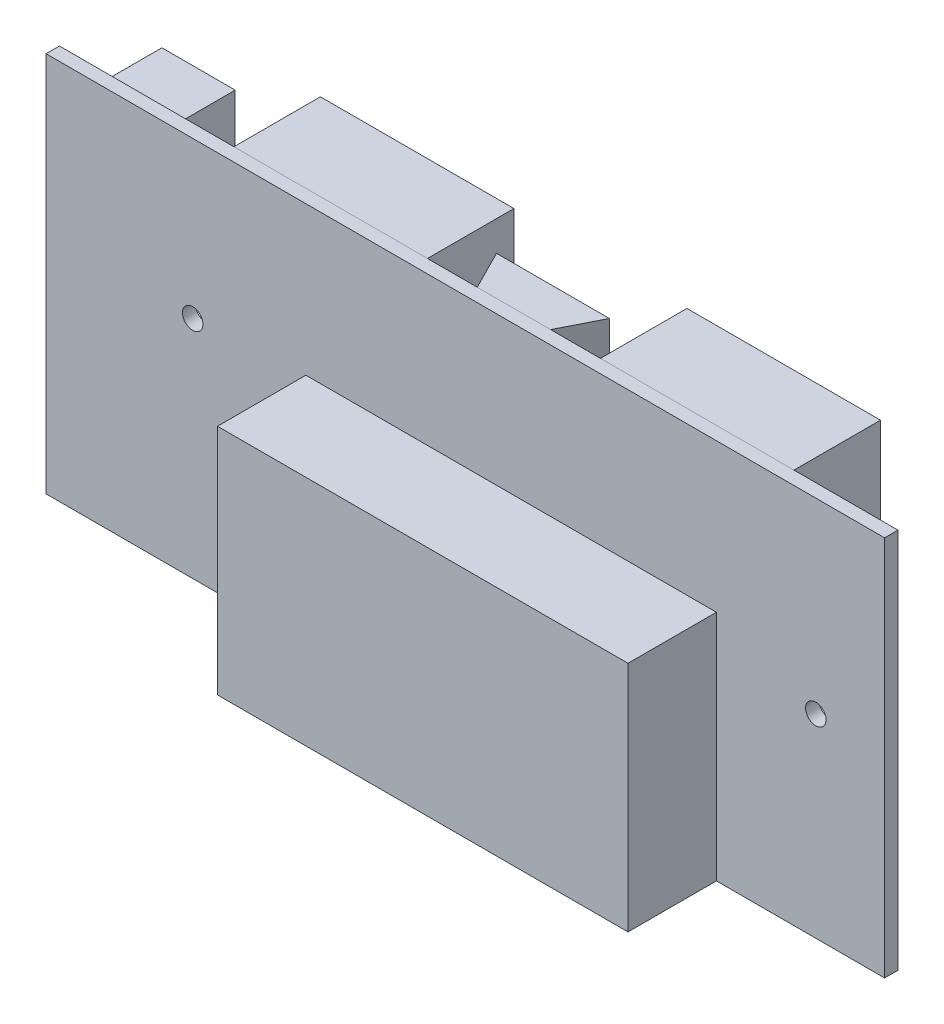
ISO-10303-21;
HEADER;
FILE_DESCRIPTION(('STEP AP214'),'2;1');
FILE_NAME('part.step','',(''),(''),'','','');
FILE_SCHEMA(('AUTOMOTIVE_DESIGN { 1 0 10303 214 1 1 1 1 }'));
ENDSEC;
DATA;
#1=APPLICATION_CONTEXT('core data for automotive mechanical design processes');
#2=APPLICATION_PROTOCOL_DEFINITION('international standard','automotive_design',2000,#1);
#3=PRODUCT_CONTEXT('',#1,'mechanical');
#4=PRODUCT('Part','Part','',(#3));
#5=PRODUCT_RELATED_PRODUCT_CATEGORY('part','',(#4));
#6=PRODUCT_DEFINITION_FORMATION('','',#4);
#7=PRODUCT_DEFINITION_CONTEXT('part definition',#1,'design');
#8=PRODUCT_DEFINITION('design','',#6,#7);
#9=PRODUCT_DEFINITION_SHAPE('','',#8);
#10=(LENGTH_UNIT() NAMED_UNIT(*) SI_UNIT(.MILLI.,.METRE.));
#11=(NAMED_UNIT(*) PLANE_ANGLE_UNIT() SI_UNIT($,.RADIAN.));
#12=(NAMED_UNIT(*) SI_UNIT($,.STERADIAN.) SOLID_ANGLE_UNIT());
#13=UNCERTAINTY_MEASURE_WITH_UNIT(LENGTH_MEASURE(1.E-05),#10,'distance_accuracy_value','');
#14=(GEOMETRIC_REPRESENTATION_CONTEXT(3) GLOBAL_UNCERTAINTY_ASSIGNED_CONTEXT((#13)) GLOBAL_UNIT_ASSIGNED_CONTEXT((#10,
#11,#12)) REPRESENTATION_CONTEXT('',''));
#15=CARTESIAN_POINT('',(0.,0.,0.));
#16=DIRECTION('',(0.,0.,1.));
#17=DIRECTION('',(1.,0.,0.));
#18=AXIS2_PLACEMENT_3D('',#15,#16,#17);
#19=CARTESIAN_POINT('',(5.,22.4,-0.909999999999994));
#20=DIRECTION('',(0.,0.,1.));
#21=DIRECTION('',(1.,0.,0.));
#22=AXIS2_PLACEMENT_3D('',#19,#20,#21);
#23=PLANE('',#22);
#24=DIRECTION('',(0.,1.,0.));
#25=VECTOR('',#24,1.);
#26=CARTESIAN_POINT('',(0.,22.4,-0.909999999999994));
#27=LINE('',#26,#25);
#28=CARTESIAN_POINT('',(0.,16.4,-0.909999999999994));
#29=VERTEX_POINT('',#28);
#30=CARTESIAN_POINT('',(0.,22.4,-0.909999999999994));
#31=VERTEX_POINT('',#30);
#32=EDGE_CURVE('E113',#29,#31,#27,.T.);
#33=ORIENTED_EDGE('',*,*,#32,.F.);
#34=DIRECTION('',(-1.,0.,0.));
#35=VECTOR('',#34,1.);
#36=CARTESIAN_POINT('',(5.,16.4,-0.909999999999994));
#37=LINE('',#36,#35);
#38=CARTESIAN_POINT('',(5.,16.4,-0.909999999999994));
#39=VERTEX_POINT('',#38);
#40=EDGE_CURVE('E56',#39,#29,#37,.T.);
#41=ORIENTED_EDGE('',*,*,#40,.F.);
#42=DIRECTION('',(0.,1.,0.));
#43=VECTOR('',#42,1.);
#44=CARTESIAN_POINT('',(5.,22.4,-0.909999999999994));
#45=LINE('',#44,#43);
#46=CARTESIAN_POINT('',(5.,22.4,-0.909999999999994));
#47=VERTEX_POINT('',#46);
#48=EDGE_CURVE('E107',#39,#47,#45,.T.);
#49=ORIENTED_EDGE('',*,*,#48,.T.);
#50=DIRECTION('',(-1.,0.,0.));
#51=VECTOR('',#50,1.);
#52=CARTESIAN_POINT('',(5.,22.4,-0.909999999999994));
#53=LINE('',#52,#51);
#54=EDGE_CURVE('E50',#47,#31,#53,.T.);
#55=ORIENTED_EDGE('',*,*,#54,.T.);
#56=EDGE_LOOP('',(#33,#41,#49,#55));
#57=FACE_BOUND('',#56,.T.);
#58=ADVANCED_FACE('F47',(#57),#23,.T.);
#59=CARTESIAN_POINT('',(5.,16.4,-0.909999999999994));
#60=DIRECTION('',(0.,-1.,0.));
#61=DIRECTION('',(0.,0.,-1.));
#62=AXIS2_PLACEMENT_3D('',#59,#60,#61);
#63=PLANE('',#62);
#64=DIRECTION('',(0.,0.,1.));
#65=VECTOR('',#64,1.);
#66=CARTESIAN_POINT('',(0.,16.4,-0.909999999999994));
#67=LINE('',#66,#65);
#68=CARTESIAN_POINT('',(0.,16.4,-7.89999999999999));
#69=VERTEX_POINT('',#68);
#70=EDGE_CURVE('E109',#69,#29,#67,.T.);
#71=ORIENTED_EDGE('',*,*,#70,.F.);
#72=DIRECTION('',(-1.,0.,0.));
#73=VECTOR('',#72,1.);
#74=CARTESIAN_POINT('',(5.,16.4,-7.89999999999999));
#75=LINE('',#74,#73);
#76=CARTESIAN_POINT('',(5.,16.4,-7.89999999999999));
#77=VERTEX_POINT('',#76);
#78=EDGE_CURVE('E81',#77,#69,#75,.T.);
#79=ORIENTED_EDGE('',*,*,#78,.F.);
#80=DIRECTION('',(0.,0.,1.));
#81=VECTOR('',#80,1.);
#82=CARTESIAN_POINT('',(5.,16.4,-0.909999999999994));
#83=LINE('',#82,#81);
#84=EDGE_CURVE('E104',#77,#39,#83,.T.);
#85=ORIENTED_EDGE('',*,*,#84,.T.);
#86=ORIENTED_EDGE('',*,*,#40,.T.);
#87=EDGE_LOOP('',(#71,#79,#85,#86));
#88=FACE_BOUND('',#87,.T.);
#89=ADVANCED_FACE('F125',(#88),#63,.T.);
#90=CARTESIAN_POINT('',(5.,22.4,-7.89999999999999));
#91=DIRECTION('',(0.,0.,-1.));
#92=DIRECTION('',(-1.,0.,0.));
#93=AXIS2_PLACEMENT_3D('',#90,#91,#92);
#94=PLANE('',#93);
#95=DIRECTION('',(0.,-1.,0.));
#96=VECTOR('',#95,1.);
#97=CARTESIAN_POINT('',(0.,22.4,-7.89999999999999));
#98=LINE('',#97,#96);
#99=CARTESIAN_POINT('',(0.,22.4,-7.89999999999999));
#100=VERTEX_POINT('',#99);
#101=EDGE_CURVE('E99',#100,#69,#98,.T.);
#102=ORIENTED_EDGE('',*,*,#101,.F.);
#103=DIRECTION('',(-1.,0.,0.));
#104=VECTOR('',#103,1.);
#105=CARTESIAN_POINT('',(5.,22.4,-7.89999999999999));
#106=LINE('',#105,#104);
#107=CARTESIAN_POINT('',(5.,22.4,-7.89999999999999));
#108=VERTEX_POINT('',#107);
#109=EDGE_CURVE('E94',#108,#100,#106,.T.);
#110=ORIENTED_EDGE('',*,*,#109,.F.);
#111=DIRECTION('',(0.,-1.,0.));
#112=VECTOR('',#111,1.);
#113=CARTESIAN_POINT('',(5.,22.4,-7.89999999999999));
#114=LINE('',#113,#112);
#115=EDGE_CURVE('E97',#108,#77,#114,.T.);
#116=ORIENTED_EDGE('',*,*,#115,.T.);
#117=ORIENTED_EDGE('',*,*,#78,.T.);
#118=EDGE_LOOP('',(#102,#110,#116,#117));
#119=FACE_BOUND('',#118,.T.);
#120=ADVANCED_FACE('F96',(#119),#94,.T.);
#121=CARTESIAN_POINT('',(5.,22.4,-0.909999999999994));
#122=DIRECTION('',(0.,1.,0.));
#123=DIRECTION('',(0.,0.,1.));
#124=AXIS2_PLACEMENT_3D('',#121,#122,#123);
#125=PLANE('',#124);
#126=DIRECTION('',(0.,0.,-1.));
#127=VECTOR('',#126,1.);
#128=CARTESIAN_POINT('',(0.,22.4,-0.909999999999994));
#129=LINE('',#128,#127);
#130=EDGE_CURVE('E116',#31,#100,#129,.T.);
#131=ORIENTED_EDGE('',*,*,#130,.F.);
#132=ORIENTED_EDGE('',*,*,#54,.F.);
#133=DIRECTION('',(0.,0.,-1.));
#134=VECTOR('',#133,1.);
#135=CARTESIAN_POINT('',(5.,22.4,-0.909999999999994));
#136=LINE('',#135,#134);
#137=EDGE_CURVE('E103',#47,#108,#136,.T.);
#138=ORIENTED_EDGE('',*,*,#137,.T.);
#139=ORIENTED_EDGE('',*,*,#109,.T.);
#140=EDGE_LOOP('',(#131,#132,#138,#139));
#141=FACE_BOUND('',#140,.T.);
#142=ADVANCED_FACE('F106',(#141),#125,.T.);
#143=CARTESIAN_POINT('',(5.,0.,0.));
#144=DIRECTION('',(1.,0.,0.));
#145=DIRECTION('',(0.,0.,-1.));
#146=AXIS2_PLACEMENT_3D('',#143,#144,#145);
#147=PLANE('',#146);
#148=ORIENTED_EDGE('',*,*,#48,.F.);
#149=ORIENTED_EDGE('',*,*,#84,.F.);
#150=ORIENTED_EDGE('',*,*,#115,.F.);
#151=ORIENTED_EDGE('',*,*,#137,.F.);
#152=EDGE_LOOP('',(#148,#149,#150,#151));
#153=FACE_BOUND('',#152,.T.);
#154=ADVANCED_FACE('F102',(#153),#147,.T.);
#155=CARTESIAN_POINT('',(0.,0.,0.));
#156=DIRECTION('',(1.,0.,0.));
#157=DIRECTION('',(0.,0.,-1.));
#158=AXIS2_PLACEMENT_3D('',#155,#156,#157);
#159=PLANE('',#158);
#160=CARTESIAN_POINT('',(0.,19.4,-4.40499999999999));
#161=DIRECTION('',(-1.,0.,0.));
#162=DIRECTION('',(0.,0.,1.));
#163=AXIS2_PLACEMENT_3D('',#160,#161,#162);
#164=CIRCLE('',#163,1.);
#165=CARTESIAN_POINT('',(0.,19.4,-3.40499999999999));
#166=VERTEX_POINT('',#165);
#167=EDGE_CURVE('E12',#166,#166,#164,.T.);
#168=ORIENTED_EDGE('',*,*,#167,.F.);
#169=EDGE_LOOP('',(#168));
#170=FACE_BOUND('',#169,.T.);
#171=ORIENTED_EDGE('',*,*,#32,.T.);
#172=ORIENTED_EDGE('',*,*,#130,.T.);
#173=ORIENTED_EDGE('',*,*,#101,.T.);
#174=ORIENTED_EDGE('',*,*,#70,.T.);
#175=EDGE_LOOP('',(#171,#172,#173,#174));
#176=FACE_BOUND('',#175,.T.);
#177=ADVANCED_FACE('F124',(#170,#176),#159,.F.);
#178=CARTESIAN_POINT('',(-1.,19.4,-4.40499999999999));
#179=DIRECTION('',(1.,0.,0.));
#180=DIRECTION('',(0.,0.,-1.));
#181=AXIS2_PLACEMENT_3D('',#178,#179,#180);
#182=CYLINDRICAL_SURFACE('',#181,1.);
#183=CARTESIAN_POINT('',(-1.,19.4,-4.40499999999999));
#184=DIRECTION('',(-1.,0.,0.));
#185=DIRECTION('',(0.,0.,1.));
#186=AXIS2_PLACEMENT_3D('',#183,#184,#185);
#187=CIRCLE('',#186,1.);
#188=CARTESIAN_POINT('',(-1.,19.4,-3.40499999999999));
#189=VERTEX_POINT('',#188);
#190=EDGE_CURVE('E117',#189,#189,#187,.T.);
#191=ORIENTED_EDGE('',*,*,#190,.F.);
#192=EDGE_LOOP('',(#191));
#193=FACE_BOUND('',#192,.T.);
#194=ORIENTED_EDGE('',*,*,#167,.T.);
#195=EDGE_LOOP('',(#194));
#196=FACE_BOUND('',#195,.T.);
#197=ADVANCED_FACE('F142',(#193,#196),#182,.T.);
#198=CARTESIAN_POINT('',(-1.,19.4,-4.40499999999999));
#199=DIRECTION('',(-1.,0.,0.));
#200=DIRECTION('',(0.,0.,1.));
#201=AXIS2_PLACEMENT_3D('',#198,#199,#200);
#202=PLANE('',#201);
#203=ORIENTED_EDGE('',*,*,#190,.T.);
#204=EDGE_LOOP('',(#203));
#205=FACE_BOUND('',#204,.T.);
#206=ADVANCED_FACE('F147',(#205),#202,.T.);
#207=CLOSED_SHELL('',(#58,#89,#120,#142,#154,#177,#197,#206));
#208=MANIFOLD_SOLID_BREP('B2',#207);
#209=CARTESIAN_POINT('',(33.5,16.,-0.909999999999994));
#210=DIRECTION('',(-0.891729215454604,0.,-0.452569338670569));
#211=DIRECTION('',(-0.452569338670569,0.,0.891729215454604));
#212=AXIS2_PLACEMENT_3D('',#209,#210,#211);
#213=PLANE('',#212);
#214=DIRECTION('',(-0.452569338670569,0.,0.891729215454604));
#215=VECTOR('',#214,1.);
#216=CARTESIAN_POINT('',(33.5,26.,-0.909999999999994));
#217=LINE('',#216,#215);
#218=CARTESIAN_POINT('',(34.85,26.,-3.56999999999999));
#219=VERTEX_POINT('',#218);
#220=CARTESIAN_POINT('',(33.5,26.,-0.909999999999994));
#221=VERTEX_POINT('',#220);
#222=EDGE_CURVE('E257',#219,#221,#217,.T.);
#223=ORIENTED_EDGE('',*,*,#222,.T.);
#224=DIRECTION('',(0.,1.,0.));
#225=VECTOR('',#224,1.);
#226=CARTESIAN_POINT('',(33.5,16.,-0.909999999999994));
#227=LINE('',#226,#225);
#228=CARTESIAN_POINT('',(33.5,16.,-0.909999999999994));
#229=VERTEX_POINT('',#228);
#230=EDGE_CURVE('E45',#229,#221,#227,.T.);
#231=ORIENTED_EDGE('',*,*,#230,.F.);
#232=DIRECTION('',(-0.452569338670569,0.,0.891729215454604));
#233=VECTOR('',#232,1.);
#234=CARTESIAN_POINT('',(33.5,16.,-0.909999999999994));
#235=LINE('',#234,#233);
#236=CARTESIAN_POINT('',(34.85,16.,-3.56999999999999));
#237=VERTEX_POINT('',#236);
#238=EDGE_CURVE('E245',#237,#229,#235,.T.);
#239=ORIENTED_EDGE('',*,*,#238,.F.);
#240=DIRECTION('',(0.,1.,0.));
#241=VECTOR('',#240,1.);
#242=CARTESIAN_POINT('',(34.85,16.,-3.56999999999999));
#243=LINE('',#242,#241);
#244=EDGE_CURVE('E253',#237,#219,#243,.T.);
#245=ORIENTED_EDGE('',*,*,#244,.T.);
#246=EDGE_LOOP('',(#223,#231,#239,#245));
#247=FACE_BOUND('',#246,.T.);
#248=ADVANCED_FACE('F194',(#247),#213,.F.);
#249=CARTESIAN_POINT('',(33.5,16.,-0.909999999999994));
#250=DIRECTION('',(0.,0.,-1.));
#251=DIRECTION('',(-1.,0.,0.));
#252=AXIS2_PLACEMENT_3D('',#249,#250,#251);
#253=PLANE('',#252);
#254=DIRECTION('',(-1.,0.,0.));
#255=VECTOR('',#254,1.);
#256=CARTESIAN_POINT('',(33.5,26.,-0.909999999999994));
#257=LINE('',#256,#255);
#258=CARTESIAN_POINT('',(28.5,26.,-0.909999999999994));
#259=VERTEX_POINT('',#258);
#260=EDGE_CURVE('E249',#221,#259,#257,.T.);
#261=ORIENTED_EDGE('',*,*,#260,.T.);
#262=DIRECTION('',(0.,1.,0.));
#263=VECTOR('',#262,1.);
#264=CARTESIAN_POINT('',(28.5,16.,-0.909999999999994));
#265=LINE('',#264,#263);
#266=CARTESIAN_POINT('',(28.5,16.,-0.909999999999994));
#267=VERTEX_POINT('',#266);
#268=EDGE_CURVE('E202',#267,#259,#265,.T.);
#269=ORIENTED_EDGE('',*,*,#268,.F.);
#270=DIRECTION('',(-1.,0.,0.));
#271=VECTOR('',#270,1.);
#272=CARTESIAN_POINT('',(33.5,16.,-0.909999999999994));
#273=LINE('',#272,#271);
#274=EDGE_CURVE('E240',#229,#267,#273,.T.);
#275=ORIENTED_EDGE('',*,*,#274,.F.);
#276=ORIENTED_EDGE('',*,*,#230,.T.);
#277=EDGE_LOOP('',(#261,#269,#275,#276));
#278=FACE_BOUND('',#277,.T.);
#279=ADVANCED_FACE('F248',(#278),#253,.F.);
#280=CARTESIAN_POINT('',(28.5,16.,-0.909999999999994));
#281=DIRECTION('',(0.891729215454604,0.,-0.452569338670569));
#282=DIRECTION('',(-0.452569338670569,0.,-0.891729215454604));
#283=AXIS2_PLACEMENT_3D('',#280,#281,#282);
#284=PLANE('',#283);
#285=DIRECTION('',(-0.452569338670569,0.,-0.891729215454604));
#286=VECTOR('',#285,1.);
#287=CARTESIAN_POINT('',(28.5,26.,-0.909999999999994));
#288=LINE('',#287,#286);
#289=CARTESIAN_POINT('',(27.15,26.,-3.56999999999999));
#290=VERTEX_POINT('',#289);
#291=EDGE_CURVE('E227',#259,#290,#288,.T.);
#292=ORIENTED_EDGE('',*,*,#291,.T.);
#293=DIRECTION('',(0.,1.,0.));
#294=VECTOR('',#293,1.);
#295=CARTESIAN_POINT('',(27.15,16.,-3.56999999999999));
#296=LINE('',#295,#294);
#297=CARTESIAN_POINT('',(27.15,16.,-3.56999999999999));
#298=VERTEX_POINT('',#297);
#299=EDGE_CURVE('E250',#298,#290,#296,.T.);
#300=ORIENTED_EDGE('',*,*,#299,.F.);
#301=DIRECTION('',(-0.452569338670569,0.,-0.891729215454604));
#302=VECTOR('',#301,1.);
#303=CARTESIAN_POINT('',(28.5,16.,-0.909999999999994));
#304=LINE('',#303,#302);
#305=EDGE_CURVE('E243',#267,#298,#304,.T.);
#306=ORIENTED_EDGE('',*,*,#305,.F.);
#307=ORIENTED_EDGE('',*,*,#268,.T.);
#308=EDGE_LOOP('',(#292,#300,#306,#307));
#309=FACE_BOUND('',#308,.T.);
#310=ADVANCED_FACE('F251',(#309),#284,.F.);
#311=CARTESIAN_POINT('',(27.15,16.,-3.56999999999999));
#312=DIRECTION('',(0.,0.,1.));
#313=DIRECTION('',(1.,0.,0.));
#314=AXIS2_PLACEMENT_3D('',#311,#312,#313);
#315=PLANE('',#314);
#316=DIRECTION('',(1.,0.,0.));
#317=VECTOR('',#316,1.);
#318=CARTESIAN_POINT('',(27.15,26.,-3.56999999999999));
#319=LINE('',#318,#317);
#320=EDGE_CURVE('E233',#290,#219,#319,.T.);
#321=ORIENTED_EDGE('',*,*,#320,.T.);
#322=ORIENTED_EDGE('',*,*,#244,.F.);
#323=DIRECTION('',(1.,0.,0.));
#324=VECTOR('',#323,1.);
#325=CARTESIAN_POINT('',(27.15,16.,-3.56999999999999));
#326=LINE('',#325,#324);
#327=EDGE_CURVE('E210',#298,#237,#326,.T.);
#328=ORIENTED_EDGE('',*,*,#327,.F.);
#329=ORIENTED_EDGE('',*,*,#299,.T.);
#330=EDGE_LOOP('',(#321,#322,#328,#329));
#331=FACE_BOUND('',#330,.T.);
#332=ADVANCED_FACE('F264',(#331),#315,.F.);
#333=CARTESIAN_POINT('',(0.,16.,0.));
#334=DIRECTION('',(0.,-1.,0.));
#335=DIRECTION('',(0.,0.,-1.));
#336=AXIS2_PLACEMENT_3D('',#333,#334,#335);
#337=PLANE('',#336);
#338=ORIENTED_EDGE('',*,*,#238,.T.);
#339=ORIENTED_EDGE('',*,*,#274,.T.);
#340=ORIENTED_EDGE('',*,*,#305,.T.);
#341=ORIENTED_EDGE('',*,*,#327,.T.);
#342=EDGE_LOOP('',(#338,#339,#340,#341));
#343=FACE_BOUND('',#342,.T.);
#344=ADVANCED_FACE('F241',(#343),#337,.T.);
#345=CARTESIAN_POINT('',(0.,26.,0.));
#346=DIRECTION('',(0.,-1.,0.));
#347=DIRECTION('',(0.,0.,-1.));
#348=AXIS2_PLACEMENT_3D('',#345,#346,#347);
#349=PLANE('',#348);
#350=ORIENTED_EDGE('',*,*,#222,.F.);
#351=ORIENTED_EDGE('',*,*,#320,.F.);
#352=ORIENTED_EDGE('',*,*,#291,.F.);
#353=ORIENTED_EDGE('',*,*,#260,.F.);
#354=EDGE_LOOP('',(#350,#351,#352,#353));
#355=FACE_BOUND('',#354,.T.);
#356=ADVANCED_FACE('F267',(#355),#349,.F.);
#357=CLOSED_SHELL('',(#248,#279,#310,#332,#344,#356));
#358=MANIFOLD_SOLID_BREP('B6',#357);
#359=CARTESIAN_POINT('',(50.1,16.,-0.909999999999994));
#360=DIRECTION('',(-1.,0.,0.));
#361=DIRECTION('',(0.,0.,1.));
#362=AXIS2_PLACEMENT_3D('',#359,#360,#361);
#363=PLANE('',#362);
#364=DIRECTION('',(0.,0.,1.));
#365=VECTOR('',#364,1.);
#366=CARTESIAN_POINT('',(50.1,26.,-0.909999999999994));
#367=LINE('',#366,#365);
#368=CARTESIAN_POINT('',(50.1,26.,-6.81000000000001));
#369=VERTEX_POINT('',#368);
#370=CARTESIAN_POINT('',(50.1,26.,-0.909999999999994));
#371=VERTEX_POINT('',#370);
#372=EDGE_CURVE('E378',#369,#371,#367,.T.);
#373=ORIENTED_EDGE('',*,*,#372,.T.);
#374=DIRECTION('',(0.,1.,0.));
#375=VECTOR('',#374,1.);
#376=CARTESIAN_POINT('',(50.1,16.,-0.909999999999994));
#377=LINE('',#376,#375);
#378=CARTESIAN_POINT('',(50.1,16.,-0.909999999999994));
#379=VERTEX_POINT('',#378);
#380=EDGE_CURVE('E192',#379,#371,#377,.T.);
#381=ORIENTED_EDGE('',*,*,#380,.F.);
#382=DIRECTION('',(0.,0.,1.));
#383=VECTOR('',#382,1.);
#384=CARTESIAN_POINT('',(50.1,16.,-0.909999999999994));
#385=LINE('',#384,#383);
#386=CARTESIAN_POINT('',(50.1,16.,-6.81000000000001));
#387=VERTEX_POINT('',#386);
#388=EDGE_CURVE('E366',#387,#379,#385,.T.);
#389=ORIENTED_EDGE('',*,*,#388,.F.);
#390=DIRECTION('',(0.,1.,0.));
#391=VECTOR('',#390,1.);
#392=CARTESIAN_POINT('',(50.1,16.,-6.81000000000001));
#393=LINE('',#392,#391);
#394=EDGE_CURVE('E374',#387,#369,#393,.T.);
#395=ORIENTED_EDGE('',*,*,#394,.T.);
#396=EDGE_LOOP('',(#373,#381,#389,#395));
#397=FACE_BOUND('',#396,.T.);
#398=ADVANCED_FACE('F315',(#397),#363,.F.);
#399=CARTESIAN_POINT('',(36.9,16.,-0.909999999999994));
#400=DIRECTION('',(0.,0.,-1.));
#401=DIRECTION('',(-1.,0.,0.));
#402=AXIS2_PLACEMENT_3D('',#399,#400,#401);
#403=PLANE('',#402);
#404=DIRECTION('',(-1.,0.,0.));
#405=VECTOR('',#404,1.);
#406=CARTESIAN_POINT('',(36.9,26.,-0.909999999999994));
#407=LINE('',#406,#405);
#408=CARTESIAN_POINT('',(36.9,26.,-0.909999999999994));
#409=VERTEX_POINT('',#408);
#410=EDGE_CURVE('E370',#371,#409,#407,.T.);
#411=ORIENTED_EDGE('',*,*,#410,.T.);
#412=DIRECTION('',(0.,1.,0.));
#413=VECTOR('',#412,1.);
#414=CARTESIAN_POINT('',(36.9,16.,-0.909999999999994));
#415=LINE('',#414,#413);
#416=CARTESIAN_POINT('',(36.9,16.,-0.909999999999994));
#417=VERTEX_POINT('',#416);
#418=EDGE_CURVE('E323',#417,#409,#415,.T.);
#419=ORIENTED_EDGE('',*,*,#418,.F.);
#420=DIRECTION('',(-1.,0.,0.));
#421=VECTOR('',#420,1.);
#422=CARTESIAN_POINT('',(36.9,16.,-0.909999999999994));
#423=LINE('',#422,#421);
#424=EDGE_CURVE('E361',#379,#417,#423,.T.);
#425=ORIENTED_EDGE('',*,*,#424,.F.);
#426=ORIENTED_EDGE('',*,*,#380,.T.);
#427=EDGE_LOOP('',(#411,#419,#425,#426));
#428=FACE_BOUND('',#427,.T.);
#429=ADVANCED_FACE('F369',(#428),#403,.F.);
#430=CARTESIAN_POINT('',(36.9,16.,-0.909999999999994));
#431=DIRECTION('',(1.,0.,0.));
#432=DIRECTION('',(0.,0.,-1.));
#433=AXIS2_PLACEMENT_3D('',#430,#431,#432);
#434=PLANE('',#433);
#435=DIRECTION('',(0.,0.,-1.));
#436=VECTOR('',#435,1.);
#437=CARTESIAN_POINT('',(36.9,26.,-0.909999999999994));
#438=LINE('',#437,#436);
#439=CARTESIAN_POINT('',(36.9,26.,-6.81000000000001));
#440=VERTEX_POINT('',#439);
#441=EDGE_CURVE('E348',#409,#440,#438,.T.);
#442=ORIENTED_EDGE('',*,*,#441,.T.);
#443=DIRECTION('',(0.,1.,0.));
#444=VECTOR('',#443,1.);
#445=CARTESIAN_POINT('',(36.9,16.,-6.81000000000001));
#446=LINE('',#445,#444);
#447=CARTESIAN_POINT('',(36.9,16.,-6.81000000000001));
#448=VERTEX_POINT('',#447);
#449=EDGE_CURVE('E371',#448,#440,#446,.T.);
#450=ORIENTED_EDGE('',*,*,#449,.F.);
#451=DIRECTION('',(0.,0.,-1.));
#452=VECTOR('',#451,1.);
#453=CARTESIAN_POINT('',(36.9,16.,-0.909999999999994));
#454=LINE('',#453,#452);
#455=EDGE_CURVE('E364',#417,#448,#454,.T.);
#456=ORIENTED_EDGE('',*,*,#455,.F.);
#457=ORIENTED_EDGE('',*,*,#418,.T.);
#458=EDGE_LOOP('',(#442,#450,#456,#457));
#459=FACE_BOUND('',#458,.T.);
#460=ADVANCED_FACE('F372',(#459),#434,.F.);
#461=CARTESIAN_POINT('',(36.9,16.,-6.81000000000001));
#462=DIRECTION('',(0.,0.,1.));
#463=DIRECTION('',(1.,0.,0.));
#464=AXIS2_PLACEMENT_3D('',#461,#462,#463);
#465=PLANE('',#464);
#466=DIRECTION('',(1.,0.,0.));
#467=VECTOR('',#466,1.);
#468=CARTESIAN_POINT('',(36.9,26.,-6.81000000000001));
#469=LINE('',#468,#467);
#470=EDGE_CURVE('E354',#440,#369,#469,.T.);
#471=ORIENTED_EDGE('',*,*,#470,.T.);
#472=ORIENTED_EDGE('',*,*,#394,.F.);
#473=DIRECTION('',(1.,0.,0.));
#474=VECTOR('',#473,1.);
#475=CARTESIAN_POINT('',(36.9,16.,-6.81000000000001));
#476=LINE('',#475,#474);
#477=EDGE_CURVE('E331',#448,#387,#476,.T.);
#478=ORIENTED_EDGE('',*,*,#477,.F.);
#479=ORIENTED_EDGE('',*,*,#449,.T.);
#480=EDGE_LOOP('',(#471,#472,#478,#479));
#481=FACE_BOUND('',#480,.T.);
#482=ADVANCED_FACE('F385',(#481),#465,.F.);
#483=CARTESIAN_POINT('',(0.,16.,0.));
#484=DIRECTION('',(0.,-1.,0.));
#485=DIRECTION('',(0.,0.,-1.));
#486=AXIS2_PLACEMENT_3D('',#483,#484,#485);
#487=PLANE('',#486);
#488=ORIENTED_EDGE('',*,*,#388,.T.);
#489=ORIENTED_EDGE('',*,*,#424,.T.);
#490=ORIENTED_EDGE('',*,*,#455,.T.);
#491=ORIENTED_EDGE('',*,*,#477,.T.);
#492=EDGE_LOOP('',(#488,#489,#490,#491));
#493=FACE_BOUND('',#492,.T.);
#494=ADVANCED_FACE('F362',(#493),#487,.T.);
#495=CARTESIAN_POINT('',(0.,26.,0.));
#496=DIRECTION('',(0.,-1.,0.));
#497=DIRECTION('',(0.,0.,-1.));
#498=AXIS2_PLACEMENT_3D('',#495,#496,#497);
#499=PLANE('',#498);
#500=ORIENTED_EDGE('',*,*,#372,.F.);
#501=ORIENTED_EDGE('',*,*,#470,.F.);
#502=ORIENTED_EDGE('',*,*,#441,.F.);
#503=ORIENTED_EDGE('',*,*,#410,.F.);
#504=EDGE_LOOP('',(#500,#501,#502,#503));
#505=FACE_BOUND('',#504,.T.);
#506=ADVANCED_FACE('F388',(#505),#499,.F.);
#507=CLOSED_SHELL('',(#398,#429,#460,#482,#494,#506));
#508=MANIFOLD_SOLID_BREP('B39',#507);
#509=CARTESIAN_POINT('',(11.9,16.,-0.909999999999994));
#510=DIRECTION('',(1.,0.,0.));
#511=DIRECTION('',(0.,0.,-1.));
#512=AXIS2_PLACEMENT_3D('',#509,#510,#511);
#513=PLANE('',#512);
#514=DIRECTION('',(0.,0.,-1.));
#515=VECTOR('',#514,1.);
#516=CARTESIAN_POINT('',(11.9,26.,-0.909999999999994));
#517=LINE('',#516,#515);
#518=CARTESIAN_POINT('',(11.9,26.,-0.909999999999994));
#519=VERTEX_POINT('',#518);
#520=CARTESIAN_POINT('',(11.9,26.,-6.81000000000001));
#521=VERTEX_POINT('',#520);
#522=EDGE_CURVE('E498',#519,#521,#517,.T.);
#523=ORIENTED_EDGE('',*,*,#522,.T.);
#524=DIRECTION('',(0.,1.,0.));
#525=VECTOR('',#524,1.);
#526=CARTESIAN_POINT('',(11.9,16.,-6.81000000000001));
#527=LINE('',#526,#525);
#528=CARTESIAN_POINT('',(11.9,16.,-6.81000000000001));
#529=VERTEX_POINT('',#528);
#530=EDGE_CURVE('E313',#529,#521,#527,.T.);
#531=ORIENTED_EDGE('',*,*,#530,.F.);
#532=DIRECTION('',(0.,0.,-1.));
#533=VECTOR('',#532,1.);
#534=CARTESIAN_POINT('',(11.9,16.,-0.909999999999994));
#535=LINE('',#534,#533);
#536=CARTESIAN_POINT('',(11.9,16.,-0.909999999999994));
#537=VERTEX_POINT('',#536);
#538=EDGE_CURVE('E486',#537,#529,#535,.T.);
#539=ORIENTED_EDGE('',*,*,#538,.F.);
#540=DIRECTION('',(0.,1.,0.));
#541=VECTOR('',#540,1.);
#542=CARTESIAN_POINT('',(11.9,16.,-0.909999999999994));
#543=LINE('',#542,#541);
#544=EDGE_CURVE('E494',#537,#519,#543,.T.);
#545=ORIENTED_EDGE('',*,*,#544,.T.);
#546=EDGE_LOOP('',(#523,#531,#539,#545));
#547=FACE_BOUND('',#546,.T.);
#548=ADVANCED_FACE('F435',(#547),#513,.F.);
#549=CARTESIAN_POINT('',(25.1,16.,-6.81000000000001));
#550=DIRECTION('',(0.,0.,1.));
#551=DIRECTION('',(1.,0.,0.));
#552=AXIS2_PLACEMENT_3D('',#549,#550,#551);
#553=PLANE('',#552);
#554=DIRECTION('',(1.,0.,0.));
#555=VECTOR('',#554,1.);
#556=CARTESIAN_POINT('',(25.1,26.,-6.81000000000001));
#557=LINE('',#556,#555);
#558=CARTESIAN_POINT('',(25.1,26.,-6.81000000000001));
#559=VERTEX_POINT('',#558);
#560=EDGE_CURVE('E490',#521,#559,#557,.T.);
#561=ORIENTED_EDGE('',*,*,#560,.T.);
#562=DIRECTION('',(0.,1.,0.));
#563=VECTOR('',#562,1.);
#564=CARTESIAN_POINT('',(25.1,16.,-6.81000000000001));
#565=LINE('',#564,#563);
#566=CARTESIAN_POINT('',(25.1,16.,-6.81000000000001));
#567=VERTEX_POINT('',#566);
#568=EDGE_CURVE('E443',#567,#559,#565,.T.);
#569=ORIENTED_EDGE('',*,*,#568,.F.);
#570=DIRECTION('',(1.,0.,0.));
#571=VECTOR('',#570,1.);
#572=CARTESIAN_POINT('',(25.1,16.,-6.81000000000001));
#573=LINE('',#572,#571);
#574=EDGE_CURVE('E481',#529,#567,#573,.T.);
#575=ORIENTED_EDGE('',*,*,#574,.F.);
#576=ORIENTED_EDGE('',*,*,#530,.T.);
#577=EDGE_LOOP('',(#561,#569,#575,#576));
#578=FACE_BOUND('',#577,.T.);
#579=ADVANCED_FACE('F489',(#578),#553,.F.);
#580=CARTESIAN_POINT('',(25.1,16.,-0.909999999999994));
#581=DIRECTION('',(-1.,0.,0.));
#582=DIRECTION('',(0.,0.,1.));
#583=AXIS2_PLACEMENT_3D('',#580,#581,#582);
#584=PLANE('',#583);
#585=DIRECTION('',(0.,0.,1.));
#586=VECTOR('',#585,1.);
#587=CARTESIAN_POINT('',(25.1,26.,-0.909999999999994));
#588=LINE('',#587,#586);
#589=CARTESIAN_POINT('',(25.1,26.,-0.909999999999994));
#590=VERTEX_POINT('',#589);
#591=EDGE_CURVE('E468',#559,#590,#588,.T.);
#592=ORIENTED_EDGE('',*,*,#591,.T.);
#593=DIRECTION('',(0.,1.,0.));
#594=VECTOR('',#593,1.);
#595=CARTESIAN_POINT('',(25.1,16.,-0.909999999999994));
#596=LINE('',#595,#594);
#597=CARTESIAN_POINT('',(25.1,16.,-0.909999999999994));
#598=VERTEX_POINT('',#597);
#599=EDGE_CURVE('E491',#598,#590,#596,.T.);
#600=ORIENTED_EDGE('',*,*,#599,.F.);
#601=DIRECTION('',(0.,0.,1.));
#602=VECTOR('',#601,1.);
#603=CARTESIAN_POINT('',(25.1,16.,-0.909999999999994));
#604=LINE('',#603,#602);
#605=EDGE_CURVE('E484',#567,#598,#604,.T.);
#606=ORIENTED_EDGE('',*,*,#605,.F.);
#607=ORIENTED_EDGE('',*,*,#568,.T.);
#608=EDGE_LOOP('',(#592,#600,#606,#607));
#609=FACE_BOUND('',#608,.T.);
#610=ADVANCED_FACE('F492',(#609),#584,.F.);
#611=CARTESIAN_POINT('',(25.1,16.,-0.909999999999994));
#612=DIRECTION('',(0.,0.,-1.));
#613=DIRECTION('',(-1.,0.,0.));
#614=AXIS2_PLACEMENT_3D('',#611,#612,#613);
#615=PLANE('',#614);
#616=DIRECTION('',(-1.,0.,0.));
#617=VECTOR('',#616,1.);
#618=CARTESIAN_POINT('',(25.1,26.,-0.909999999999994));
#619=LINE('',#618,#617);
#620=EDGE_CURVE('E474',#590,#519,#619,.T.);
#621=ORIENTED_EDGE('',*,*,#620,.T.);
#622=ORIENTED_EDGE('',*,*,#544,.F.);
#623=DIRECTION('',(-1.,0.,0.));
#624=VECTOR('',#623,1.);
#625=CARTESIAN_POINT('',(25.1,16.,-0.909999999999994));
#626=LINE('',#625,#624);
#627=EDGE_CURVE('E451',#598,#537,#626,.T.);
#628=ORIENTED_EDGE('',*,*,#627,.F.);
#629=ORIENTED_EDGE('',*,*,#599,.T.);
#630=EDGE_LOOP('',(#621,#622,#628,#629));
#631=FACE_BOUND('',#630,.T.);
#632=ADVANCED_FACE('F505',(#631),#615,.F.);
#633=CARTESIAN_POINT('',(0.,16.,0.));
#634=DIRECTION('',(0.,1.,0.));
#635=DIRECTION('',(0.,0.,1.));
#636=AXIS2_PLACEMENT_3D('',#633,#634,#635);
#637=PLANE('',#636);
#638=ORIENTED_EDGE('',*,*,#538,.T.);
#639=ORIENTED_EDGE('',*,*,#574,.T.);
#640=ORIENTED_EDGE('',*,*,#605,.T.);
#641=ORIENTED_EDGE('',*,*,#627,.T.);
#642=EDGE_LOOP('',(#638,#639,#640,#641));
#643=FACE_BOUND('',#642,.T.);
#644=ADVANCED_FACE('F482',(#643),#637,.F.);
#645=CARTESIAN_POINT('',(0.,26.,0.));
#646=DIRECTION('',(0.,1.,0.));
#647=DIRECTION('',(0.,0.,1.));
#648=AXIS2_PLACEMENT_3D('',#645,#646,#647);
#649=PLANE('',#648);
#650=ORIENTED_EDGE('',*,*,#522,.F.);
#651=ORIENTED_EDGE('',*,*,#620,.F.);
#652=ORIENTED_EDGE('',*,*,#591,.F.);
#653=ORIENTED_EDGE('',*,*,#560,.F.);
#654=EDGE_LOOP('',(#650,#651,#652,#653));
#655=FACE_BOUND('',#654,.T.);
#656=ADVANCED_FACE('F508',(#655),#649,.T.);
#657=CLOSED_SHELL('',(#548,#579,#610,#632,#644,#656));
#658=MANIFOLD_SOLID_BREP('B186',#657);
#659=CARTESIAN_POINT('',(0.,0.,0.));
#660=DIRECTION('',(0.,0.,-1.));
#661=DIRECTION('',(-1.,0.,0.));
#662=AXIS2_PLACEMENT_3D('',#659,#660,#661);
#663=PLANE('',#662);
#664=CARTESIAN_POINT('',(10.,15.36,0.));
#665=DIRECTION('',(0.,0.,1.));
#666=DIRECTION('',(1.,0.,0.));
#667=AXIS2_PLACEMENT_3D('',#664,#665,#666);
#668=CIRCLE('',#667,0.699999999999999);
#669=CARTESIAN_POINT('',(10.7,15.36,0.));
#670=VERTEX_POINT('',#669);
#671=EDGE_CURVE('E670',#670,#670,#668,.T.);
#672=ORIENTED_EDGE('',*,*,#671,.F.);
#673=EDGE_LOOP('',(#672));
#674=FACE_BOUND('',#673,.T.);
#675=CARTESIAN_POINT('',(52.5,13.25,0.));
#676=DIRECTION('',(0.,0.,1.));
#677=DIRECTION('',(1.,0.,0.));
#678=AXIS2_PLACEMENT_3D('',#675,#676,#677);
#679=CIRCLE('',#678,0.700000000000001);
#680=CARTESIAN_POINT('',(53.2,13.25,0.));
#681=VERTEX_POINT('',#680);
#682=EDGE_CURVE('E675',#681,#681,#679,.T.);
#683=ORIENTED_EDGE('',*,*,#682,.F.);
#684=EDGE_LOOP('',(#683));
#685=FACE_BOUND('',#684,.T.);
#686=DIRECTION('',(0.,-1.,0.));
#687=VECTOR('',#686,1.);
#688=CARTESIAN_POINT('',(17.72,0.,0.));
#689=LINE('',#688,#687);
#690=CARTESIAN_POINT('',(17.72,15.87,0.));
#691=VERTEX_POINT('',#690);
#692=CARTESIAN_POINT('',(17.72,0.,0.));
#693=VERTEX_POINT('',#692);
#694=EDGE_CURVE('E563',#691,#693,#689,.T.);
#695=ORIENTED_EDGE('',*,*,#694,.F.);
#696=DIRECTION('',(-1.,0.,0.));
#697=VECTOR('',#696,1.);
#698=CARTESIAN_POINT('',(17.72,15.87,0.));
#699=LINE('',#698,#697);
#700=CARTESIAN_POINT('',(45.72,15.87,0.));
#701=VERTEX_POINT('',#700);
#702=EDGE_CURVE('E631',#701,#691,#699,.T.);
#703=ORIENTED_EDGE('',*,*,#702,.F.);
#704=DIRECTION('',(0.,1.,0.));
#705=VECTOR('',#704,1.);
#706=CARTESIAN_POINT('',(45.72,0.,0.));
#707=LINE('',#706,#705);
#708=CARTESIAN_POINT('',(45.72,0.,0.));
#709=VERTEX_POINT('',#708);
#710=EDGE_CURVE('E569',#709,#701,#707,.T.);
#711=ORIENTED_EDGE('',*,*,#710,.F.);
#712=DIRECTION('',(1.,0.,0.));
#713=VECTOR('',#712,1.);
#714=CARTESIAN_POINT('',(0.,0.,0.));
#715=LINE('',#714,#713);
#716=CARTESIAN_POINT('',(57.19,0.,0.));
#717=VERTEX_POINT('',#716);
#718=EDGE_CURVE('E637',#709,#717,#715,.T.);
#719=ORIENTED_EDGE('',*,*,#718,.T.);
#720=DIRECTION('',(0.,1.,0.));
#721=VECTOR('',#720,1.);
#722=CARTESIAN_POINT('',(57.19,0.,0.));
#723=LINE('',#722,#721);
#724=CARTESIAN_POINT('',(57.19,26.,0.));
#725=VERTEX_POINT('',#724);
#726=EDGE_CURVE('E659',#717,#725,#723,.T.);
#727=ORIENTED_EDGE('',*,*,#726,.T.);
#728=DIRECTION('',(-1.,0.,0.));
#729=VECTOR('',#728,1.);
#730=CARTESIAN_POINT('',(0.,26.,0.));
#731=LINE('',#730,#729);
#732=CARTESIAN_POINT('',(0.,26.,0.));
#733=VERTEX_POINT('',#732);
#734=EDGE_CURVE('E647',#725,#733,#731,.T.);
#735=ORIENTED_EDGE('',*,*,#734,.T.);
#736=DIRECTION('',(0.,-1.,0.));
#737=VECTOR('',#736,1.);
#738=CARTESIAN_POINT('',(0.,0.,0.));
#739=LINE('',#738,#737);
#740=CARTESIAN_POINT('',(0.,0.,0.));
#741=VERTEX_POINT('',#740);
#742=EDGE_CURVE('E634',#733,#741,#739,.T.);
#743=ORIENTED_EDGE('',*,*,#742,.T.);
#744=EDGE_CURVE('E657',#741,#693,#715,.T.);
#745=ORIENTED_EDGE('',*,*,#744,.T.);
#746=EDGE_LOOP('',(#695,#703,#711,#719,#727,#735,#743,#745));
#747=FACE_BOUND('',#746,.T.);
#748=ADVANCED_FACE('F546',(#674,#685,#747),#663,.F.);
#749=CARTESIAN_POINT('',(0.,0.,-0.909999999999994));
#750=DIRECTION('',(-1.,0.,0.));
#751=DIRECTION('',(0.,0.,1.));
#752=AXIS2_PLACEMENT_3D('',#749,#750,#751);
#753=PLANE('',#752);
#754=ORIENTED_EDGE('',*,*,#742,.F.);
#755=DIRECTION('',(0.,0.,1.));
#756=VECTOR('',#755,1.);
#757=CARTESIAN_POINT('',(0.,26.,-0.909999999999994));
#758=LINE('',#757,#756);
#759=CARTESIAN_POINT('',(0.,26.,-0.909999999999994));
#760=VERTEX_POINT('',#759);
#761=EDGE_CURVE('E433',#760,#733,#758,.T.);
#762=ORIENTED_EDGE('',*,*,#761,.F.);
#763=DIRECTION('',(0.,-1.,0.));
#764=VECTOR('',#763,1.);
#765=CARTESIAN_POINT('',(0.,0.,-0.909999999999994));
#766=LINE('',#765,#764);
#767=CARTESIAN_POINT('',(0.,0.,-0.909999999999994));
#768=VERTEX_POINT('',#767);
#769=EDGE_CURVE('E643',#760,#768,#766,.T.);
#770=ORIENTED_EDGE('',*,*,#769,.T.);
#771=DIRECTION('',(0.,0.,1.));
#772=VECTOR('',#771,1.);
#773=CARTESIAN_POINT('',(0.,0.,-0.909999999999994));
#774=LINE('',#773,#772);
#775=EDGE_CURVE('E655',#768,#741,#774,.T.);
#776=ORIENTED_EDGE('',*,*,#775,.T.);
#777=EDGE_LOOP('',(#754,#762,#770,#776));
#778=FACE_BOUND('',#777,.T.);
#779=ADVANCED_FACE('F548',(#778),#753,.T.);
#780=CARTESIAN_POINT('',(0.,26.,-0.909999999999994));
#781=DIRECTION('',(0.,1.,0.));
#782=DIRECTION('',(0.,0.,1.));
#783=AXIS2_PLACEMENT_3D('',#780,#781,#782);
#784=PLANE('',#783);
#785=ORIENTED_EDGE('',*,*,#734,.F.);
#786=DIRECTION('',(0.,0.,1.));
#787=VECTOR('',#786,1.);
#788=CARTESIAN_POINT('',(57.19,26.,-0.909999999999994));
#789=LINE('',#788,#787);
#790=CARTESIAN_POINT('',(57.19,26.,-0.909999999999994));
#791=VERTEX_POINT('',#790);
#792=EDGE_CURVE('E555',#791,#725,#789,.T.);
#793=ORIENTED_EDGE('',*,*,#792,.F.);
#794=DIRECTION('',(-1.,0.,0.));
#795=VECTOR('',#794,1.);
#796=CARTESIAN_POINT('',(0.,26.,-0.909999999999994));
#797=LINE('',#796,#795);
#798=EDGE_CURVE('E653',#791,#760,#797,.T.);
#799=ORIENTED_EDGE('',*,*,#798,.T.);
#800=ORIENTED_EDGE('',*,*,#761,.T.);
#801=EDGE_LOOP('',(#785,#793,#799,#800));
#802=FACE_BOUND('',#801,.T.);
#803=ADVANCED_FACE('F709',(#802),#784,.T.);
#804=CARTESIAN_POINT('',(57.19,0.,-0.909999999999994));
#805=DIRECTION('',(1.,0.,0.));
#806=DIRECTION('',(0.,0.,-1.));
#807=AXIS2_PLACEMENT_3D('',#804,#805,#806);
#808=PLANE('',#807);
#809=ORIENTED_EDGE('',*,*,#726,.F.);
#810=DIRECTION('',(0.,0.,1.));
#811=VECTOR('',#810,1.);
#812=CARTESIAN_POINT('',(57.19,0.,-0.909999999999994));
#813=LINE('',#812,#811);
#814=CARTESIAN_POINT('',(57.19,0.,-0.909999999999994));
#815=VERTEX_POINT('',#814);
#816=EDGE_CURVE('E665',#815,#717,#813,.T.);
#817=ORIENTED_EDGE('',*,*,#816,.F.);
#818=DIRECTION('',(0.,1.,0.));
#819=VECTOR('',#818,1.);
#820=CARTESIAN_POINT('',(57.19,0.,-0.909999999999994));
#821=LINE('',#820,#819);
#822=EDGE_CURVE('E650',#815,#791,#821,.T.);
#823=ORIENTED_EDGE('',*,*,#822,.T.);
#824=ORIENTED_EDGE('',*,*,#792,.T.);
#825=EDGE_LOOP('',(#809,#817,#823,#824));
#826=FACE_BOUND('',#825,.T.);
#827=ADVANCED_FACE('F716',(#826),#808,.T.);
#828=CARTESIAN_POINT('',(0.,0.,-0.909999999999994));
#829=DIRECTION('',(0.,-1.,0.));
#830=DIRECTION('',(0.,0.,-1.));
#831=AXIS2_PLACEMENT_3D('',#828,#829,#830);
#832=PLANE('',#831);
#833=ORIENTED_EDGE('',*,*,#744,.F.);
#834=ORIENTED_EDGE('',*,*,#775,.F.);
#835=DIRECTION('',(1.,0.,0.));
#836=VECTOR('',#835,1.);
#837=CARTESIAN_POINT('',(0.,0.,-0.909999999999994));
#838=LINE('',#837,#836);
#839=EDGE_CURVE('E646',#768,#815,#838,.T.);
#840=ORIENTED_EDGE('',*,*,#839,.T.);
#841=ORIENTED_EDGE('',*,*,#816,.T.);
#842=ORIENTED_EDGE('',*,*,#718,.F.);
#843=DIRECTION('',(0.,0.,-1.));
#844=VECTOR('',#843,1.);
#845=CARTESIAN_POINT('',(45.72,0.,6.03000000000001));
#846=LINE('',#845,#844);
#847=CARTESIAN_POINT('',(45.72,0.,6.03000000000001));
#848=VERTEX_POINT('',#847);
#849=EDGE_CURVE('E618',#848,#709,#846,.T.);
#850=ORIENTED_EDGE('',*,*,#849,.F.);
#851=DIRECTION('',(1.,0.,0.));
#852=VECTOR('',#851,1.);
#853=CARTESIAN_POINT('',(17.72,0.,6.03000000000001));
#854=LINE('',#853,#852);
#855=CARTESIAN_POINT('',(17.72,0.,6.03000000000001));
#856=VERTEX_POINT('',#855);
#857=EDGE_CURVE('E611',#856,#848,#854,.T.);
#858=ORIENTED_EDGE('',*,*,#857,.F.);
#859=DIRECTION('',(0.,0.,-1.));
#860=VECTOR('',#859,1.);
#861=CARTESIAN_POINT('',(17.72,0.,6.03000000000001));
#862=LINE('',#861,#860);
#863=EDGE_CURVE('E616',#856,#693,#862,.T.);
#864=ORIENTED_EDGE('',*,*,#863,.T.);
#865=EDGE_LOOP('',(#833,#834,#840,#841,#842,#850,#858,#864));
#866=FACE_BOUND('',#865,.T.);
#867=ADVANCED_FACE('F614',(#866),#832,.T.);
#868=CARTESIAN_POINT('',(0.,0.,-0.909999999999994));
#869=DIRECTION('',(0.,0.,-1.));
#870=DIRECTION('',(-1.,0.,0.));
#871=AXIS2_PLACEMENT_3D('',#868,#869,#870);
#872=PLANE('',#871);
#873=CARTESIAN_POINT('',(10.,15.36,-0.909999999999994));
#874=DIRECTION('',(0.,0.,-1.));
#875=DIRECTION('',(-1.,0.,0.));
#876=AXIS2_PLACEMENT_3D('',#873,#874,#875);
#877=CIRCLE('',#876,0.699999999999999);
#878=CARTESIAN_POINT('',(9.30000000000001,15.36,-0.909999999999994));
#879=VERTEX_POINT('',#878);
#880=EDGE_CURVE('E550',#879,#879,#877,.T.);
#881=ORIENTED_EDGE('',*,*,#880,.F.);
#882=EDGE_LOOP('',(#881));
#883=FACE_BOUND('',#882,.T.);
#884=CARTESIAN_POINT('',(52.5,13.25,-0.909999999999994));
#885=DIRECTION('',(0.,0.,-1.));
#886=DIRECTION('',(-1.,0.,0.));
#887=AXIS2_PLACEMENT_3D('',#884,#885,#886);
#888=CIRCLE('',#887,0.700000000000001);
#889=CARTESIAN_POINT('',(51.8,13.25,-0.909999999999994));
#890=VERTEX_POINT('',#889);
#891=EDGE_CURVE('E668',#890,#890,#888,.T.);
#892=ORIENTED_EDGE('',*,*,#891,.F.);
#893=EDGE_LOOP('',(#892));
#894=FACE_BOUND('',#893,.T.);
#895=ORIENTED_EDGE('',*,*,#769,.F.);
#896=ORIENTED_EDGE('',*,*,#798,.F.);
#897=ORIENTED_EDGE('',*,*,#822,.F.);
#898=ORIENTED_EDGE('',*,*,#839,.F.);
#899=EDGE_LOOP('',(#895,#896,#897,#898));
#900=FACE_BOUND('',#899,.T.);
#901=ADVANCED_FACE('F701',(#883,#894,#900),#872,.T.);
#902=CARTESIAN_POINT('',(17.72,0.,6.03000000000001));
#903=DIRECTION('',(1.,0.,0.));
#904=DIRECTION('',(0.,0.,-1.));
#905=AXIS2_PLACEMENT_3D('',#902,#903,#904);
#906=PLANE('',#905);
#907=ORIENTED_EDGE('',*,*,#694,.T.);
#908=ORIENTED_EDGE('',*,*,#863,.F.);
#909=DIRECTION('',(0.,-1.,0.));
#910=VECTOR('',#909,1.);
#911=CARTESIAN_POINT('',(17.72,0.,6.03000000000001));
#912=LINE('',#911,#910);
#913=CARTESIAN_POINT('',(17.72,15.87,6.03000000000001));
#914=VERTEX_POINT('',#913);
#915=EDGE_CURVE('E622',#914,#856,#912,.T.);
#916=ORIENTED_EDGE('',*,*,#915,.F.);
#917=DIRECTION('',(0.,0.,-1.));
#918=VECTOR('',#917,1.);
#919=CARTESIAN_POINT('',(17.72,15.87,6.03000000000001));
#920=LINE('',#919,#918);
#921=EDGE_CURVE('E684',#914,#691,#920,.T.);
#922=ORIENTED_EDGE('',*,*,#921,.T.);
#923=EDGE_LOOP('',(#907,#908,#916,#922));
#924=FACE_BOUND('',#923,.T.);
#925=ADVANCED_FACE('F633',(#924),#906,.F.);
#926=CARTESIAN_POINT('',(45.72,0.,6.03000000000001));
#927=DIRECTION('',(-1.,0.,0.));
#928=DIRECTION('',(0.,0.,1.));
#929=AXIS2_PLACEMENT_3D('',#926,#927,#928);
#930=PLANE('',#929);
#931=ORIENTED_EDGE('',*,*,#710,.T.);
#932=DIRECTION('',(0.,0.,-1.));
#933=VECTOR('',#932,1.);
#934=CARTESIAN_POINT('',(45.72,15.87,6.03000000000001));
#935=LINE('',#934,#933);
#936=CARTESIAN_POINT('',(45.72,15.87,6.03000000000001));
#937=VERTEX_POINT('',#936);
#938=EDGE_CURVE('E639',#937,#701,#935,.T.);
#939=ORIENTED_EDGE('',*,*,#938,.F.);
#940=DIRECTION('',(0.,1.,0.));
#941=VECTOR('',#940,1.);
#942=CARTESIAN_POINT('',(45.72,0.,6.03000000000001));
#943=LINE('',#942,#941);
#944=EDGE_CURVE('E621',#848,#937,#943,.T.);
#945=ORIENTED_EDGE('',*,*,#944,.F.);
#946=ORIENTED_EDGE('',*,*,#849,.T.);
#947=EDGE_LOOP('',(#931,#939,#945,#946));
#948=FACE_BOUND('',#947,.T.);
#949=ADVANCED_FACE('F693',(#948),#930,.F.);
#950=CARTESIAN_POINT('',(17.72,15.87,6.03000000000001));
#951=DIRECTION('',(0.,-1.,0.));
#952=DIRECTION('',(0.,0.,-1.));
#953=AXIS2_PLACEMENT_3D('',#950,#951,#952);
#954=PLANE('',#953);
#955=ORIENTED_EDGE('',*,*,#702,.T.);
#956=ORIENTED_EDGE('',*,*,#921,.F.);
#957=DIRECTION('',(-1.,0.,0.));
#958=VECTOR('',#957,1.);
#959=CARTESIAN_POINT('',(17.72,15.87,6.03000000000001));
#960=LINE('',#959,#958);
#961=EDGE_CURVE('E627',#937,#914,#960,.T.);
#962=ORIENTED_EDGE('',*,*,#961,.F.);
#963=ORIENTED_EDGE('',*,*,#938,.T.);
#964=EDGE_LOOP('',(#955,#956,#962,#963));
#965=FACE_BOUND('',#964,.T.);
#966=ADVANCED_FACE('F691',(#965),#954,.F.);
#967=CARTESIAN_POINT('',(0.,0.,6.03000000000001));
#968=DIRECTION('',(0.,0.,-1.));
#969=DIRECTION('',(-1.,0.,0.));
#970=AXIS2_PLACEMENT_3D('',#967,#968,#969);
#971=PLANE('',#970);
#972=ORIENTED_EDGE('',*,*,#915,.T.);
#973=ORIENTED_EDGE('',*,*,#857,.T.);
#974=ORIENTED_EDGE('',*,*,#944,.T.);
#975=ORIENTED_EDGE('',*,*,#961,.T.);
#976=EDGE_LOOP('',(#972,#973,#974,#975));
#977=FACE_BOUND('',#976,.T.);
#978=ADVANCED_FACE('F625',(#977),#971,.F.);
#979=CARTESIAN_POINT('',(52.5,13.25,-3.));
#980=DIRECTION('',(0.,0.,1.));
#981=DIRECTION('',(1.,0.,0.));
#982=AXIS2_PLACEMENT_3D('',#979,#980,#981);
#983=CYLINDRICAL_SURFACE('',#982,0.700000000000001);
#984=ORIENTED_EDGE('',*,*,#891,.T.);
#985=EDGE_LOOP('',(#984));
#986=FACE_BOUND('',#985,.T.);
#987=ORIENTED_EDGE('',*,*,#682,.T.);
#988=EDGE_LOOP('',(#987));
#989=FACE_BOUND('',#988,.T.);
#990=ADVANCED_FACE('F740',(#986,#989),#983,.F.);
#991=CARTESIAN_POINT('',(10.,15.36,-3.));
#992=DIRECTION('',(0.,0.,1.));
#993=DIRECTION('',(1.,0.,0.));
#994=AXIS2_PLACEMENT_3D('',#991,#992,#993);
#995=CYLINDRICAL_SURFACE('',#994,0.699999999999999);
#996=ORIENTED_EDGE('',*,*,#880,.T.);
#997=EDGE_LOOP('',(#996));
#998=FACE_BOUND('',#997,.T.);
#999=ORIENTED_EDGE('',*,*,#671,.T.);
#1000=EDGE_LOOP('',(#999));
#1001=FACE_BOUND('',#1000,.T.);
#1002=ADVANCED_FACE('F738',(#998,#1001),#995,.F.);
#1003=CLOSED_SHELL('',(#748,#779,#803,#827,#867,#901,#925,#949,#966,#978,#990,#1002));
#1004=MANIFOLD_SOLID_BREP('B307',#1003);
#1005=ADVANCED_BREP_SHAPE_REPRESENTATION('',(#18,#208,#358,#508,#658,#1004),#14);
#1006=SHAPE_DEFINITION_REPRESENTATION(#9,#1005);
ENDSEC;
END-ISO-10303-21;
